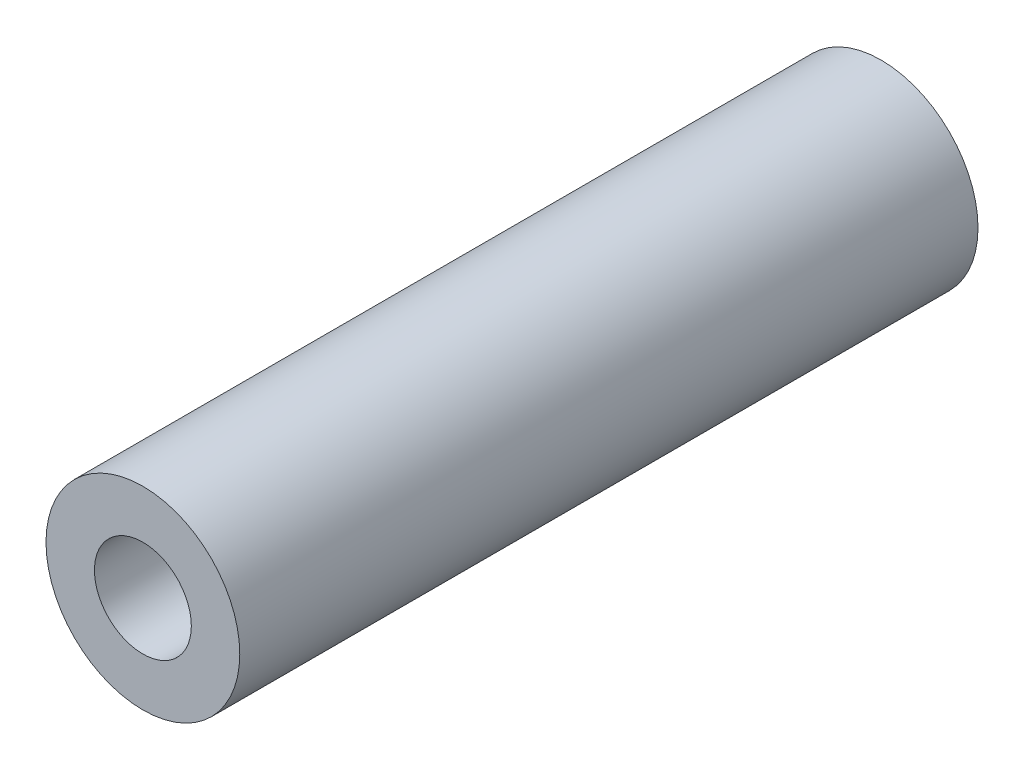
ISO-10303-21;
HEADER;
FILE_DESCRIPTION(('STEP AP214'),'2;1');
FILE_NAME('part.step','',(''),(''),'','','');
FILE_SCHEMA(('AUTOMOTIVE_DESIGN { 1 0 10303 214 1 1 1 1 }'));
ENDSEC;
DATA;
#1=APPLICATION_CONTEXT('core data for automotive mechanical design processes');
#2=APPLICATION_PROTOCOL_DEFINITION('international standard','automotive_design',2000,#1);
#3=PRODUCT_CONTEXT('',#1,'mechanical');
#4=PRODUCT('Part','Part','',(#3));
#5=PRODUCT_RELATED_PRODUCT_CATEGORY('part','',(#4));
#6=PRODUCT_DEFINITION_FORMATION('','',#4);
#7=PRODUCT_DEFINITION_CONTEXT('part definition',#1,'design');
#8=PRODUCT_DEFINITION('design','',#6,#7);
#9=PRODUCT_DEFINITION_SHAPE('','',#8);
#10=(LENGTH_UNIT() NAMED_UNIT(*) SI_UNIT(.MILLI.,.METRE.));
#11=(NAMED_UNIT(*) PLANE_ANGLE_UNIT() SI_UNIT($,.RADIAN.));
#12=(NAMED_UNIT(*) SI_UNIT($,.STERADIAN.) SOLID_ANGLE_UNIT());
#13=UNCERTAINTY_MEASURE_WITH_UNIT(LENGTH_MEASURE(1.E-05),#10,'distance_accuracy_value','');
#14=(GEOMETRIC_REPRESENTATION_CONTEXT(3) GLOBAL_UNCERTAINTY_ASSIGNED_CONTEXT((#13)) GLOBAL_UNIT_ASSIGNED_CONTEXT((#10,
#11,#12)) REPRESENTATION_CONTEXT('',''));
#15=CARTESIAN_POINT('',(0.,0.,0.));
#16=DIRECTION('',(0.,0.,1.));
#17=DIRECTION('',(1.,0.,0.));
#18=AXIS2_PLACEMENT_3D('',#15,#16,#17);
#19=CARTESIAN_POINT('',(0.,70.,10.));
#20=DIRECTION('',(0.,0.,-1.));
#21=DIRECTION('',(-1.,0.,0.));
#22=AXIS2_PLACEMENT_3D('',#19,#20,#21);
#23=CYLINDRICAL_SURFACE('',#22,10.);
#24=CARTESIAN_POINT('',(0.,70.,10.));
#25=DIRECTION('',(0.,0.,1.));
#26=DIRECTION('',(1.,0.,0.));
#27=AXIS2_PLACEMENT_3D('',#24,#25,#26);
#28=CIRCLE('',#27,10.);
#29=CARTESIAN_POINT('',(10.,70.,10.));
#30=VERTEX_POINT('',#29);
#31=EDGE_CURVE('E10',#30,#30,#28,.T.);
#32=ORIENTED_EDGE('',*,*,#31,.T.);
#33=EDGE_LOOP('',(#32));
#34=FACE_BOUND('',#33,.T.);
#35=CARTESIAN_POINT('',(0.,70.,86.2));
#36=DIRECTION('',(0.,0.,1.));
#37=DIRECTION('',(1.,0.,0.));
#38=AXIS2_PLACEMENT_3D('',#35,#36,#37);
#39=CIRCLE('',#38,10.);
#40=CARTESIAN_POINT('',(10.,70.,86.2));
#41=VERTEX_POINT('',#40);
#42=EDGE_CURVE('E47',#41,#41,#39,.T.);
#43=ORIENTED_EDGE('',*,*,#42,.F.);
#44=EDGE_LOOP('',(#43));
#45=FACE_BOUND('',#44,.T.);
#46=ADVANCED_FACE('F43',(#34,#45),#23,.T.);
#47=CARTESIAN_POINT('',(0.,70.,10.));
#48=DIRECTION('',(0.,0.,-1.));
#49=DIRECTION('',(-1.,0.,0.));
#50=AXIS2_PLACEMENT_3D('',#47,#48,#49);
#51=CYLINDRICAL_SURFACE('',#50,5.);
#52=CARTESIAN_POINT('',(0.,70.,10.));
#53=DIRECTION('',(0.,0.,1.));
#54=DIRECTION('',(1.,0.,0.));
#55=AXIS2_PLACEMENT_3D('',#52,#53,#54);
#56=CIRCLE('',#55,5.);
#57=CARTESIAN_POINT('',(5.,70.,10.));
#58=VERTEX_POINT('',#57);
#59=EDGE_CURVE('E60',#58,#58,#56,.T.);
#60=ORIENTED_EDGE('',*,*,#59,.F.);
#61=EDGE_LOOP('',(#60));
#62=FACE_BOUND('',#61,.T.);
#63=CARTESIAN_POINT('',(0.,70.,86.2));
#64=DIRECTION('',(0.,0.,1.));
#65=DIRECTION('',(1.,0.,0.));
#66=AXIS2_PLACEMENT_3D('',#63,#64,#65);
#67=CIRCLE('',#66,5.);
#68=CARTESIAN_POINT('',(5.,70.,86.2));
#69=VERTEX_POINT('',#68);
#70=EDGE_CURVE('E52',#69,#69,#67,.T.);
#71=ORIENTED_EDGE('',*,*,#70,.T.);
#72=EDGE_LOOP('',(#71));
#73=FACE_BOUND('',#72,.T.);
#74=ADVANCED_FACE('F69',(#62,#73),#51,.F.);
#75=CARTESIAN_POINT('',(0.,70.,86.2));
#76=DIRECTION('',(0.,0.,1.));
#77=DIRECTION('',(1.,0.,0.));
#78=AXIS2_PLACEMENT_3D('',#75,#76,#77);
#79=PLANE('',#78);
#80=ORIENTED_EDGE('',*,*,#70,.F.);
#81=EDGE_LOOP('',(#80));
#82=FACE_BOUND('',#81,.T.);
#83=ORIENTED_EDGE('',*,*,#42,.T.);
#84=EDGE_LOOP('',(#83));
#85=FACE_BOUND('',#84,.T.);
#86=ADVANCED_FACE('F68',(#82,#85),#79,.T.);
#87=CARTESIAN_POINT('',(0.,0.,10.));
#88=DIRECTION('',(0.,0.,1.));
#89=DIRECTION('',(1.,0.,0.));
#90=AXIS2_PLACEMENT_3D('',#87,#88,#89);
#91=PLANE('',#90);
#92=ORIENTED_EDGE('',*,*,#59,.T.);
#93=EDGE_LOOP('',(#92));
#94=FACE_BOUND('',#93,.T.);
#95=ORIENTED_EDGE('',*,*,#31,.F.);
#96=EDGE_LOOP('',(#95));
#97=FACE_BOUND('',#96,.T.);
#98=ADVANCED_FACE('F65',(#94,#97),#91,.F.);
#99=CLOSED_SHELL('',(#46,#74,#86,#98));
#100=MANIFOLD_SOLID_BREP('B2',#99);
#101=ADVANCED_BREP_SHAPE_REPRESENTATION('',(#18,#100),#14);
#102=SHAPE_DEFINITION_REPRESENTATION(#9,#101);
ENDSEC;
END-ISO-10303-21;
